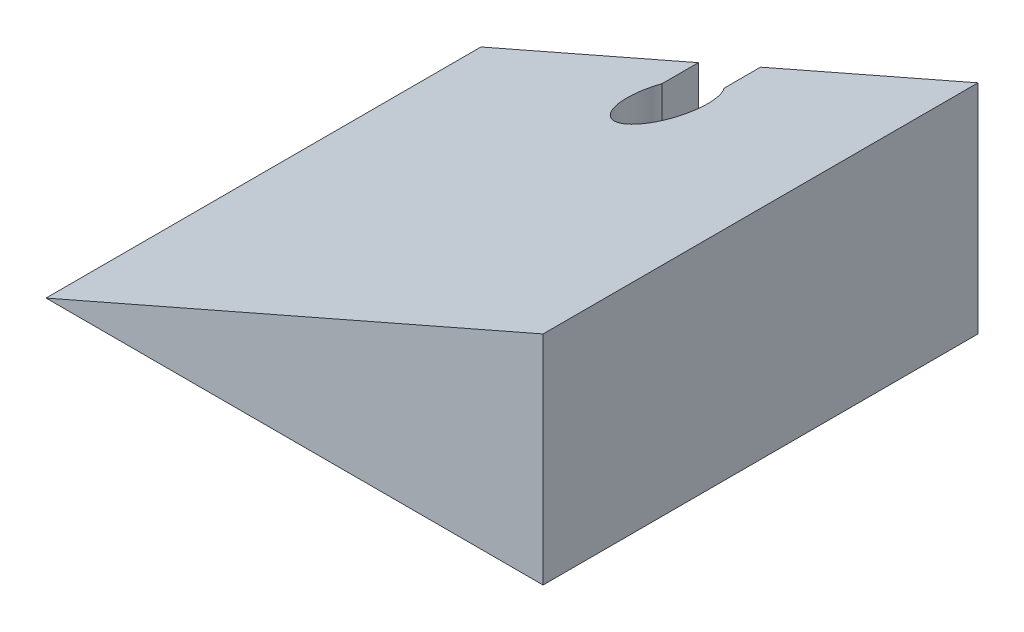
ISO-10303-21;
HEADER;
FILE_DESCRIPTION(('STEP AP214'),'2;1');
FILE_NAME('part.step','',(''),(''),'','','');
FILE_SCHEMA(('AUTOMOTIVE_DESIGN { 1 0 10303 214 1 1 1 1 }'));
ENDSEC;
DATA;
#1=APPLICATION_CONTEXT('core data for automotive mechanical design processes');
#2=APPLICATION_PROTOCOL_DEFINITION('international standard','automotive_design',2000,#1);
#3=PRODUCT_CONTEXT('',#1,'mechanical');
#4=PRODUCT('Part','Part','',(#3));
#5=PRODUCT_RELATED_PRODUCT_CATEGORY('part','',(#4));
#6=PRODUCT_DEFINITION_FORMATION('','',#4);
#7=PRODUCT_DEFINITION_CONTEXT('part definition',#1,'design');
#8=PRODUCT_DEFINITION('design','',#6,#7);
#9=PRODUCT_DEFINITION_SHAPE('','',#8);
#10=(LENGTH_UNIT() NAMED_UNIT(*) SI_UNIT(.MILLI.,.METRE.));
#11=(NAMED_UNIT(*) PLANE_ANGLE_UNIT() SI_UNIT($,.RADIAN.));
#12=(NAMED_UNIT(*) SI_UNIT($,.STERADIAN.) SOLID_ANGLE_UNIT());
#13=UNCERTAINTY_MEASURE_WITH_UNIT(LENGTH_MEASURE(1.E-05),#10,'distance_accuracy_value','');
#14=(GEOMETRIC_REPRESENTATION_CONTEXT(3) GLOBAL_UNCERTAINTY_ASSIGNED_CONTEXT((#13)) GLOBAL_UNIT_ASSIGNED_CONTEXT((#10,
#11,#12)) REPRESENTATION_CONTEXT('',''));
#15=CARTESIAN_POINT('',(0.,0.,0.));
#16=DIRECTION('',(0.,0.,1.));
#17=DIRECTION('',(1.,0.,0.));
#18=AXIS2_PLACEMENT_3D('',#15,#16,#17);
#19=CARTESIAN_POINT('',(0.,0.,0.));
#20=DIRECTION('',(0.,0.,1.));
#21=DIRECTION('',(1.,0.,0.));
#22=AXIS2_PLACEMENT_3D('',#19,#20,#21);
#23=PLANE('',#22);
#24=DIRECTION('',(-0.916157334902189,-0.400818834019708,0.));
#25=VECTOR('',#24,1.);
#26=CARTESIAN_POINT('',(-46.1666666666667,-15.6527777777778,0.));
#27=LINE('',#26,#25);
#28=CARTESIAN_POINT('',(-11.1666666666667,-0.34027777777778,0.));
#29=VERTEX_POINT('',#28);
#30=CARTESIAN_POINT('',(-46.1666666666667,-15.6527777777778,0.));
#31=VERTEX_POINT('',#30);
#32=EDGE_CURVE('E120',#29,#31,#27,.T.);
#33=ORIENTED_EDGE('',*,*,#32,.F.);
#34=DIRECTION('',(0.,-1.,0.));
#35=VECTOR('',#34,1.);
#36=CARTESIAN_POINT('',(-11.1666666666667,0.,0.));
#37=LINE('',#36,#35);
#38=CARTESIAN_POINT('',(-11.1666666666667,-15.6527777777778,0.));
#39=VERTEX_POINT('',#38);
#40=EDGE_CURVE('E11',#29,#39,#37,.T.);
#41=ORIENTED_EDGE('',*,*,#40,.T.);
#42=DIRECTION('',(1.,0.,0.));
#43=VECTOR('',#42,1.);
#44=CARTESIAN_POINT('',(-46.1666666666667,-15.6527777777778,0.));
#45=LINE('',#44,#43);
#46=EDGE_CURVE('E119',#31,#39,#45,.T.);
#47=ORIENTED_EDGE('',*,*,#46,.F.);
#48=EDGE_LOOP('',(#33,#41,#47));
#49=FACE_BOUND('',#48,.T.);
#50=ADVANCED_FACE('F37',(#49),#23,.F.);
#51=CARTESIAN_POINT('',(33.8333333333333,19.3472222222222,70.));
#52=DIRECTION('',(-1.,0.,0.));
#53=DIRECTION('',(0.,0.,1.));
#54=AXIS2_PLACEMENT_3D('',#51,#52,#53);
#55=PLANE('',#54);
#56=DIRECTION('',(0.,1.,0.));
#57=VECTOR('',#56,1.);
#58=CARTESIAN_POINT('',(33.8333333333333,19.3472222222222,0.));
#59=LINE('',#58,#57);
#60=CARTESIAN_POINT('',(33.8333333333333,-15.6527777777778,0.));
#61=VERTEX_POINT('',#60);
#62=CARTESIAN_POINT('',(33.8333333333333,19.3472222222222,0.));
#63=VERTEX_POINT('',#62);
#64=EDGE_CURVE('E144',#61,#63,#59,.T.);
#65=ORIENTED_EDGE('',*,*,#64,.T.);
#66=DIRECTION('',(0.,0.,-1.));
#67=VECTOR('',#66,1.);
#68=CARTESIAN_POINT('',(33.8333333333333,19.3472222222222,70.));
#69=LINE('',#68,#67);
#70=CARTESIAN_POINT('',(33.8333333333333,19.3472222222222,70.));
#71=VERTEX_POINT('',#70);
#72=EDGE_CURVE('E134',#71,#63,#69,.T.);
#73=ORIENTED_EDGE('',*,*,#72,.F.);
#74=DIRECTION('',(0.,1.,0.));
#75=VECTOR('',#74,1.);
#76=CARTESIAN_POINT('',(33.8333333333333,19.3472222222222,70.));
#77=LINE('',#76,#75);
#78=CARTESIAN_POINT('',(33.8333333333333,-15.6527777777778,70.));
#79=VERTEX_POINT('',#78);
#80=EDGE_CURVE('E124',#79,#71,#77,.T.);
#81=ORIENTED_EDGE('',*,*,#80,.F.);
#82=DIRECTION('',(0.,0.,-1.));
#83=VECTOR('',#82,1.);
#84=CARTESIAN_POINT('',(33.8333333333333,-15.6527777777778,70.));
#85=LINE('',#84,#83);
#86=EDGE_CURVE('E131',#79,#61,#85,.T.);
#87=ORIENTED_EDGE('',*,*,#86,.T.);
#88=EDGE_LOOP('',(#65,#73,#81,#87));
#89=FACE_BOUND('',#88,.T.);
#90=ADVANCED_FACE('F39',(#89),#55,.F.);
#91=CARTESIAN_POINT('',(-46.1666666666667,-15.6527777777778,70.));
#92=DIRECTION('',(0.400818834019708,-0.916157334902189,0.));
#93=DIRECTION('',(0.916157334902189,0.400818834019708,0.));
#94=AXIS2_PLACEMENT_3D('',#91,#92,#93);
#95=PLANE('',#94);
#96=CARTESIAN_POINT('',(-6.16666666666667,1.84722222222222,10.));
#97=DIRECTION('',(0.400818834019708,-0.916157334902189,0.));
#98=DIRECTION('',(-0.916157334902189,-0.400818834019708,0.));
#99=AXIS2_PLACEMENT_3D('',#96,#97,#98);
#100=ELLIPSE('',#99,7.09485123610777,6.5);
#101=CARTESIAN_POINT('',(-1.16666666666667,4.03472222222222,5.84668806854096));
#102=VERTEX_POINT('',#101);
#103=CARTESIAN_POINT('',(-11.1666666666667,-0.34027777777778,5.84668806854096));
#104=VERTEX_POINT('',#103);
#105=EDGE_CURVE('E145',#102,#104,#100,.T.);
#106=ORIENTED_EDGE('',*,*,#105,.T.);
#107=DIRECTION('',(0.,0.,-1.));
#108=VECTOR('',#107,1.);
#109=CARTESIAN_POINT('',(-11.1666666666667,-0.340277777777787,70.));
#110=LINE('',#109,#108);
#111=EDGE_CURVE('E147',#104,#29,#110,.T.);
#112=ORIENTED_EDGE('',*,*,#111,.T.);
#113=ORIENTED_EDGE('',*,*,#32,.T.);
#114=DIRECTION('',(0.,0.,-1.));
#115=VECTOR('',#114,1.);
#116=CARTESIAN_POINT('',(-46.1666666666667,-15.6527777777778,70.));
#117=LINE('',#116,#115);
#118=CARTESIAN_POINT('',(-46.1666666666667,-15.6527777777778,70.));
#119=VERTEX_POINT('',#118);
#120=EDGE_CURVE('E123',#119,#31,#117,.T.);
#121=ORIENTED_EDGE('',*,*,#120,.F.);
#122=DIRECTION('',(-0.916157334902189,-0.400818834019708,0.));
#123=VECTOR('',#122,1.);
#124=CARTESIAN_POINT('',(-46.1666666666667,-15.6527777777778,70.));
#125=LINE('',#124,#123);
#126=EDGE_CURVE('E84',#71,#119,#125,.T.);
#127=ORIENTED_EDGE('',*,*,#126,.F.);
#128=ORIENTED_EDGE('',*,*,#72,.T.);
#129=CARTESIAN_POINT('',(-1.16666666666668,4.03472222222222,0.));
#130=VERTEX_POINT('',#129);
#131=EDGE_CURVE('E127',#63,#130,#27,.T.);
#132=ORIENTED_EDGE('',*,*,#131,.T.);
#133=DIRECTION('',(0.,0.,1.));
#134=VECTOR('',#133,1.);
#135=CARTESIAN_POINT('',(-1.16666666666666,4.03472222222223,70.));
#136=LINE('',#135,#134);
#137=EDGE_CURVE('E52',#130,#102,#136,.T.);
#138=ORIENTED_EDGE('',*,*,#137,.T.);
#139=EDGE_LOOP('',(#106,#112,#113,#121,#127,#128,#132,#138));
#140=FACE_BOUND('',#139,.T.);
#141=ADVANCED_FACE('F141',(#140),#95,.F.);
#142=CARTESIAN_POINT('',(-46.1666666666667,-15.6527777777778,70.));
#143=DIRECTION('',(0.,1.,0.));
#144=DIRECTION('',(0.,0.,1.));
#145=AXIS2_PLACEMENT_3D('',#142,#143,#144);
#146=PLANE('',#145);
#147=ORIENTED_EDGE('',*,*,#46,.T.);
#148=DIRECTION('',(0.,0.,-1.));
#149=VECTOR('',#148,1.);
#150=CARTESIAN_POINT('',(-11.1666666666667,-15.6527777777778,0.));
#151=LINE('',#150,#149);
#152=CARTESIAN_POINT('',(-11.1666666666667,-15.6527777777778,5.84668806854096));
#153=VERTEX_POINT('',#152);
#154=EDGE_CURVE('E106',#153,#39,#151,.T.);
#155=ORIENTED_EDGE('',*,*,#154,.F.);
#156=CARTESIAN_POINT('',(-6.16666666666667,-15.6527777777778,10.));
#157=DIRECTION('',(0.,-1.,0.));
#158=DIRECTION('',(0.,0.,-1.));
#159=AXIS2_PLACEMENT_3D('',#156,#157,#158);
#160=CIRCLE('',#159,6.5);
#161=CARTESIAN_POINT('',(-1.16666666666667,-15.6527777777778,5.84668806854096));
#162=VERTEX_POINT('',#161);
#163=EDGE_CURVE('E156',#162,#153,#160,.T.);
#164=ORIENTED_EDGE('',*,*,#163,.F.);
#165=DIRECTION('',(0.,0.,1.));
#166=VECTOR('',#165,1.);
#167=CARTESIAN_POINT('',(-1.16666666666668,-15.6527777777778,0.));
#168=LINE('',#167,#166);
#169=CARTESIAN_POINT('',(-1.16666666666668,-15.6527777777778,0.));
#170=VERTEX_POINT('',#169);
#171=EDGE_CURVE('E114',#170,#162,#168,.T.);
#172=ORIENTED_EDGE('',*,*,#171,.F.);
#173=EDGE_CURVE('E78',#170,#61,#45,.T.);
#174=ORIENTED_EDGE('',*,*,#173,.T.);
#175=ORIENTED_EDGE('',*,*,#86,.F.);
#176=DIRECTION('',(1.,0.,0.));
#177=VECTOR('',#176,1.);
#178=CARTESIAN_POINT('',(-46.1666666666667,-15.6527777777778,70.));
#179=LINE('',#178,#177);
#180=EDGE_CURVE('E61',#119,#79,#179,.T.);
#181=ORIENTED_EDGE('',*,*,#180,.F.);
#182=ORIENTED_EDGE('',*,*,#120,.T.);
#183=EDGE_LOOP('',(#147,#155,#164,#172,#174,#175,#181,#182));
#184=FACE_BOUND('',#183,.T.);
#185=ADVANCED_FACE('F122',(#184),#146,.F.);
#186=CARTESIAN_POINT('',(0.,0.,70.));
#187=DIRECTION('',(0.,0.,1.));
#188=DIRECTION('',(1.,0.,0.));
#189=AXIS2_PLACEMENT_3D('',#186,#187,#188);
#190=PLANE('',#189);
#191=ORIENTED_EDGE('',*,*,#80,.T.);
#192=ORIENTED_EDGE('',*,*,#126,.T.);
#193=ORIENTED_EDGE('',*,*,#180,.T.);
#194=EDGE_LOOP('',(#191,#192,#193));
#195=FACE_BOUND('',#194,.T.);
#196=ADVANCED_FACE('F169',(#195),#190,.T.);
#197=ORIENTED_EDGE('',*,*,#173,.F.);
#198=DIRECTION('',(0.,1.,0.));
#199=VECTOR('',#198,1.);
#200=CARTESIAN_POINT('',(-1.16666666666668,0.,0.));
#201=LINE('',#200,#199);
#202=EDGE_CURVE('E45',#170,#130,#201,.T.);
#203=ORIENTED_EDGE('',*,*,#202,.T.);
#204=ORIENTED_EDGE('',*,*,#131,.F.);
#205=ORIENTED_EDGE('',*,*,#64,.F.);
#206=EDGE_LOOP('',(#197,#203,#204,#205));
#207=FACE_BOUND('',#206,.T.);
#208=ADVANCED_FACE('F137',(#207),#23,.F.);
#209=CARTESIAN_POINT('',(-6.16666666666667,54.3472222222222,10.));
#210=DIRECTION('',(0.,-1.,0.));
#211=DIRECTION('',(0.,0.,-1.));
#212=AXIS2_PLACEMENT_3D('',#209,#210,#211);
#213=CYLINDRICAL_SURFACE('',#212,6.5);
#214=DIRECTION('',(0.,-1.,0.));
#215=VECTOR('',#214,1.);
#216=CARTESIAN_POINT('',(-1.16666666666667,54.3472222222222,5.84668806854096));
#217=LINE('',#216,#215);
#218=EDGE_CURVE('E154',#102,#162,#217,.T.);
#219=ORIENTED_EDGE('',*,*,#218,.T.);
#220=ORIENTED_EDGE('',*,*,#163,.T.);
#221=DIRECTION('',(0.,-1.,0.));
#222=VECTOR('',#221,1.);
#223=CARTESIAN_POINT('',(-11.1666666666667,54.3472222222222,5.84668806854096));
#224=LINE('',#223,#222);
#225=EDGE_CURVE('E110',#104,#153,#224,.T.);
#226=ORIENTED_EDGE('',*,*,#225,.F.);
#227=ORIENTED_EDGE('',*,*,#105,.F.);
#228=EDGE_LOOP('',(#219,#220,#226,#227));
#229=FACE_BOUND('',#228,.T.);
#230=ADVANCED_FACE('F161',(#229),#213,.F.);
#231=CARTESIAN_POINT('',(-11.1666666666667,54.3472222222222,0.));
#232=DIRECTION('',(-1.,0.,0.));
#233=DIRECTION('',(0.,0.,1.));
#234=AXIS2_PLACEMENT_3D('',#231,#232,#233);
#235=PLANE('',#234);
#236=ORIENTED_EDGE('',*,*,#225,.T.);
#237=ORIENTED_EDGE('',*,*,#154,.T.);
#238=ORIENTED_EDGE('',*,*,#40,.F.);
#239=ORIENTED_EDGE('',*,*,#111,.F.);
#240=EDGE_LOOP('',(#236,#237,#238,#239));
#241=FACE_BOUND('',#240,.T.);
#242=ADVANCED_FACE('F107',(#241),#235,.F.);
#243=CARTESIAN_POINT('',(-1.16666666666668,54.3472222222222,0.));
#244=DIRECTION('',(1.,0.,0.));
#245=DIRECTION('',(0.,0.,-1.));
#246=AXIS2_PLACEMENT_3D('',#243,#244,#245);
#247=PLANE('',#246);
#248=ORIENTED_EDGE('',*,*,#202,.F.);
#249=ORIENTED_EDGE('',*,*,#171,.T.);
#250=ORIENTED_EDGE('',*,*,#218,.F.);
#251=ORIENTED_EDGE('',*,*,#137,.F.);
#252=EDGE_LOOP('',(#248,#249,#250,#251));
#253=FACE_BOUND('',#252,.T.);
#254=ADVANCED_FACE('F159',(#253),#247,.F.);
#255=CLOSED_SHELL('',(#50,#90,#141,#185,#196,#208,#230,#242,#254));
#256=MANIFOLD_SOLID_BREP('B2',#255);
#257=ADVANCED_BREP_SHAPE_REPRESENTATION('',(#18,#256),#14);
#258=SHAPE_DEFINITION_REPRESENTATION(#9,#257);
ENDSEC;
END-ISO-10303-21;
